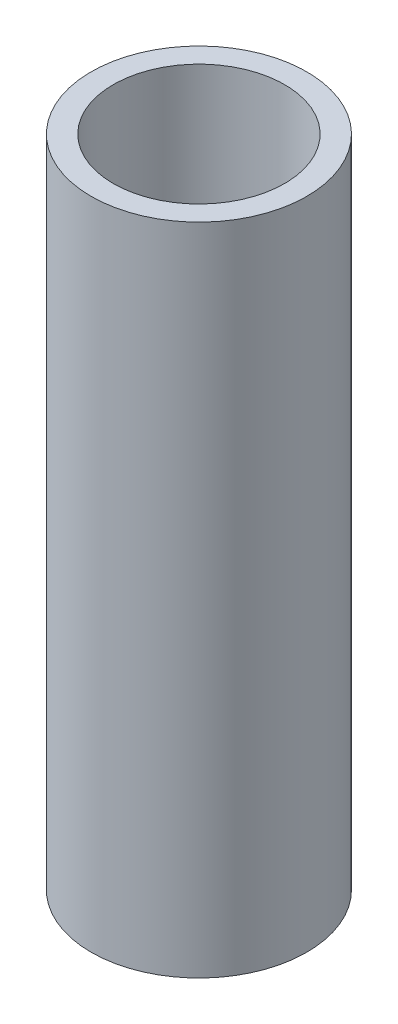
ISO-10303-21;
HEADER;
FILE_DESCRIPTION(('STEP AP214'),'2;1');
FILE_NAME('part.step','',(''),(''),'','','');
FILE_SCHEMA(('AUTOMOTIVE_DESIGN { 1 0 10303 214 1 1 1 1 }'));
ENDSEC;
DATA;
#1=APPLICATION_CONTEXT('core data for automotive mechanical design processes');
#2=APPLICATION_PROTOCOL_DEFINITION('international standard','automotive_design',2000,#1);
#3=PRODUCT_CONTEXT('',#1,'mechanical');
#4=PRODUCT('Part','Part','',(#3));
#5=PRODUCT_RELATED_PRODUCT_CATEGORY('part','',(#4));
#6=PRODUCT_DEFINITION_FORMATION('','',#4);
#7=PRODUCT_DEFINITION_CONTEXT('part definition',#1,'design');
#8=PRODUCT_DEFINITION('design','',#6,#7);
#9=PRODUCT_DEFINITION_SHAPE('','',#8);
#10=(LENGTH_UNIT() NAMED_UNIT(*) SI_UNIT(.MILLI.,.METRE.));
#11=(NAMED_UNIT(*) PLANE_ANGLE_UNIT() SI_UNIT($,.RADIAN.));
#12=(NAMED_UNIT(*) SI_UNIT($,.STERADIAN.) SOLID_ANGLE_UNIT());
#13=UNCERTAINTY_MEASURE_WITH_UNIT(LENGTH_MEASURE(1.E-05),#10,'distance_accuracy_value','');
#14=(GEOMETRIC_REPRESENTATION_CONTEXT(3) GLOBAL_UNCERTAINTY_ASSIGNED_CONTEXT((#13)) GLOBAL_UNIT_ASSIGNED_CONTEXT((#10,
#11,#12)) REPRESENTATION_CONTEXT('',''));
#15=CARTESIAN_POINT('',(0.,0.,0.));
#16=DIRECTION('',(0.,0.,1.));
#17=DIRECTION('',(1.,0.,0.));
#18=AXIS2_PLACEMENT_3D('',#15,#16,#17);
#19=CARTESIAN_POINT('',(0.,9.094875003,0.));
#20=DIRECTION('',(0.,1.,0.));
#21=DIRECTION('',(0.,0.,1.));
#22=AXIS2_PLACEMENT_3D('',#19,#20,#21);
#23=PLANE('',#22);
#24=CARTESIAN_POINT('',(0.,9.094875003,0.));
#25=DIRECTION('',(0.,1.,0.));
#26=DIRECTION('',(0.,0.,1.));
#27=AXIS2_PLACEMENT_3D('',#24,#25,#26);
#28=CIRCLE('',#27,2.9972);
#29=CARTESIAN_POINT('',(0.,9.094875003,2.9972));
#30=VERTEX_POINT('',#29);
#31=EDGE_CURVE('E12',#30,#30,#28,.T.);
#32=ORIENTED_EDGE('',*,*,#31,.T.);
#33=EDGE_LOOP('',(#32));
#34=FACE_BOUND('',#33,.T.);
#35=CARTESIAN_POINT('',(0.,9.094875003,0.));
#36=DIRECTION('',(0.,1.,0.));
#37=DIRECTION('',(0.,0.,1.));
#38=AXIS2_PLACEMENT_3D('',#35,#36,#37);
#39=CIRCLE('',#38,2.38125);
#40=CARTESIAN_POINT('',(0.,9.094875003,2.38125));
#41=VERTEX_POINT('',#40);
#42=EDGE_CURVE('E54',#41,#41,#39,.T.);
#43=ORIENTED_EDGE('',*,*,#42,.F.);
#44=EDGE_LOOP('',(#43));
#45=FACE_BOUND('',#44,.T.);
#46=ADVANCED_FACE('F43',(#34,#45),#23,.T.);
#47=CARTESIAN_POINT('',(0.,-9.094875003,0.));
#48=DIRECTION('',(0.,1.,0.));
#49=DIRECTION('',(0.,0.,1.));
#50=AXIS2_PLACEMENT_3D('',#47,#48,#49);
#51=PLANE('',#50);
#52=CARTESIAN_POINT('',(0.,-9.094875003,0.));
#53=DIRECTION('',(0.,1.,0.));
#54=DIRECTION('',(0.,0.,1.));
#55=AXIS2_PLACEMENT_3D('',#52,#53,#54);
#56=CIRCLE('',#55,2.9972);
#57=CARTESIAN_POINT('',(0.,-9.094875003,2.9972));
#58=VERTEX_POINT('',#57);
#59=EDGE_CURVE('E47',#58,#58,#56,.T.);
#60=ORIENTED_EDGE('',*,*,#59,.F.);
#61=EDGE_LOOP('',(#60));
#62=FACE_BOUND('',#61,.T.);
#63=CARTESIAN_POINT('',(0.,-9.094875003,0.));
#64=DIRECTION('',(0.,1.,0.));
#65=DIRECTION('',(0.,0.,1.));
#66=AXIS2_PLACEMENT_3D('',#63,#64,#65);
#67=CIRCLE('',#66,2.38125);
#68=CARTESIAN_POINT('',(0.,-9.094875003,2.38125));
#69=VERTEX_POINT('',#68);
#70=EDGE_CURVE('E56',#69,#69,#67,.T.);
#71=ORIENTED_EDGE('',*,*,#70,.T.);
#72=EDGE_LOOP('',(#71));
#73=FACE_BOUND('',#72,.T.);
#74=ADVANCED_FACE('F66',(#62,#73),#51,.F.);
#75=CARTESIAN_POINT('',(0.,9.094875003,0.));
#76=DIRECTION('',(0.,-1.,0.));
#77=DIRECTION('',(0.,0.,-1.));
#78=AXIS2_PLACEMENT_3D('',#75,#76,#77);
#79=CYLINDRICAL_SURFACE('',#78,2.9972);
#80=ORIENTED_EDGE('',*,*,#31,.F.);
#81=EDGE_LOOP('',(#80));
#82=FACE_BOUND('',#81,.T.);
#83=ORIENTED_EDGE('',*,*,#59,.T.);
#84=EDGE_LOOP('',(#83));
#85=FACE_BOUND('',#84,.T.);
#86=ADVANCED_FACE('F45',(#82,#85),#79,.T.);
#87=CARTESIAN_POINT('',(0.,9.094875003,0.));
#88=DIRECTION('',(0.,-1.,0.));
#89=DIRECTION('',(0.,0.,-1.));
#90=AXIS2_PLACEMENT_3D('',#87,#88,#89);
#91=CYLINDRICAL_SURFACE('',#90,2.38125);
#92=ORIENTED_EDGE('',*,*,#42,.T.);
#93=EDGE_LOOP('',(#92));
#94=FACE_BOUND('',#93,.T.);
#95=ORIENTED_EDGE('',*,*,#70,.F.);
#96=EDGE_LOOP('',(#95));
#97=FACE_BOUND('',#96,.T.);
#98=ADVANCED_FACE('F62',(#94,#97),#91,.F.);
#99=CLOSED_SHELL('',(#46,#74,#86,#98));
#100=MANIFOLD_SOLID_BREP('B2',#99);
#101=ADVANCED_BREP_SHAPE_REPRESENTATION('',(#18,#100),#14);
#102=SHAPE_DEFINITION_REPRESENTATION(#9,#101);
ENDSEC;
END-ISO-10303-21;
